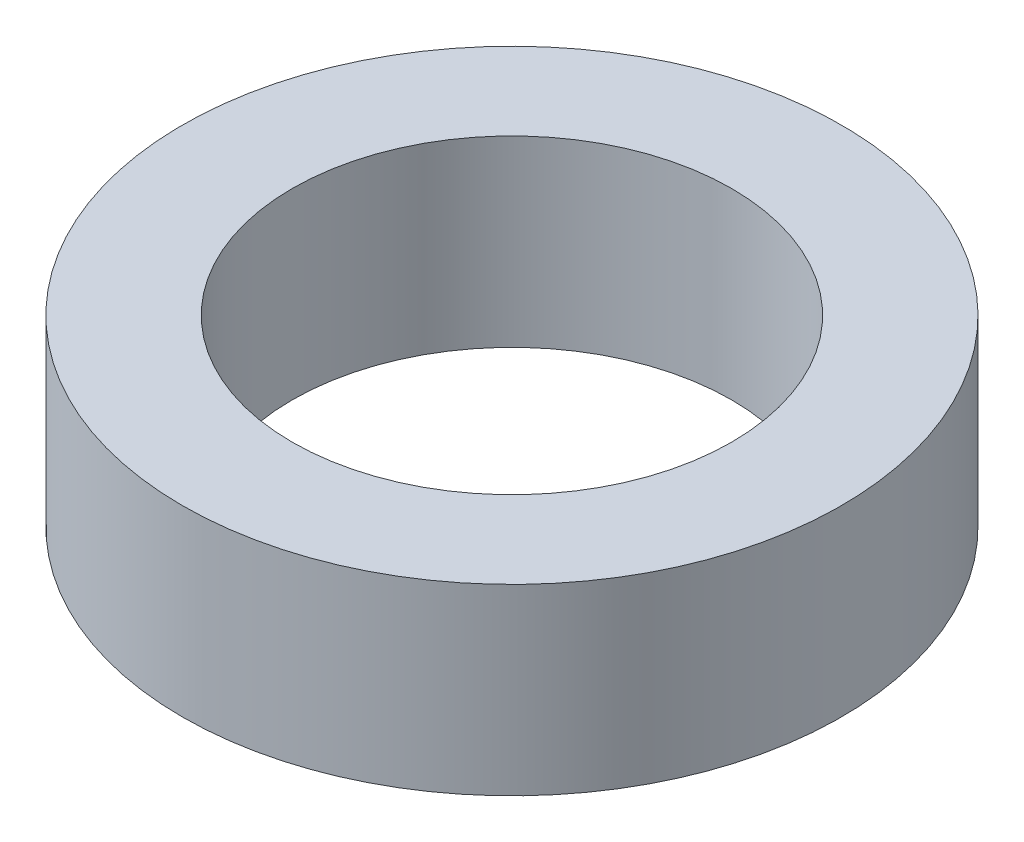
ISO-10303-21;
HEADER;
FILE_DESCRIPTION(('STEP AP214'),'2;1');
FILE_NAME('part.step','',(''),(''),'','','');
FILE_SCHEMA(('AUTOMOTIVE_DESIGN { 1 0 10303 214 1 1 1 1 }'));
ENDSEC;
DATA;
#1=APPLICATION_CONTEXT('core data for automotive mechanical design processes');
#2=APPLICATION_PROTOCOL_DEFINITION('international standard','automotive_design',2000,#1);
#3=PRODUCT_CONTEXT('',#1,'mechanical');
#4=PRODUCT('Part','Part','',(#3));
#5=PRODUCT_RELATED_PRODUCT_CATEGORY('part','',(#4));
#6=PRODUCT_DEFINITION_FORMATION('','',#4);
#7=PRODUCT_DEFINITION_CONTEXT('part definition',#1,'design');
#8=PRODUCT_DEFINITION('design','',#6,#7);
#9=PRODUCT_DEFINITION_SHAPE('','',#8);
#10=(LENGTH_UNIT() NAMED_UNIT(*) SI_UNIT(.MILLI.,.METRE.));
#11=(NAMED_UNIT(*) PLANE_ANGLE_UNIT() SI_UNIT($,.RADIAN.));
#12=(NAMED_UNIT(*) SI_UNIT($,.STERADIAN.) SOLID_ANGLE_UNIT());
#13=UNCERTAINTY_MEASURE_WITH_UNIT(LENGTH_MEASURE(1.E-05),#10,'distance_accuracy_value','');
#14=(GEOMETRIC_REPRESENTATION_CONTEXT(3) GLOBAL_UNCERTAINTY_ASSIGNED_CONTEXT((#13)) GLOBAL_UNIT_ASSIGNED_CONTEXT((#10,
#11,#12)) REPRESENTATION_CONTEXT('',''));
#15=CARTESIAN_POINT('',(0.,0.,0.));
#16=DIRECTION('',(0.,0.,1.));
#17=DIRECTION('',(1.,0.,0.));
#18=AXIS2_PLACEMENT_3D('',#15,#16,#17);
#19=CARTESIAN_POINT('',(0.,10.,0.));
#20=DIRECTION('',(0.,1.,0.));
#21=DIRECTION('',(0.,0.,1.));
#22=AXIS2_PLACEMENT_3D('',#19,#20,#21);
#23=PLANE('',#22);
#24=CARTESIAN_POINT('',(0.,10.,0.));
#25=DIRECTION('',(0.,1.,0.));
#26=DIRECTION('',(0.,0.,1.));
#27=AXIS2_PLACEMENT_3D('',#24,#25,#26);
#28=CIRCLE('',#27,18.);
#29=CARTESIAN_POINT('',(0.,10.,18.));
#30=VERTEX_POINT('',#29);
#31=EDGE_CURVE('E10',#30,#30,#28,.T.);
#32=ORIENTED_EDGE('',*,*,#31,.T.);
#33=EDGE_LOOP('',(#32));
#34=FACE_BOUND('',#33,.T.);
#35=CARTESIAN_POINT('',(0.,10.,0.));
#36=DIRECTION('',(0.,1.,0.));
#37=DIRECTION('',(0.,0.,1.));
#38=AXIS2_PLACEMENT_3D('',#35,#36,#37);
#39=CIRCLE('',#38,12.);
#40=CARTESIAN_POINT('',(0.,10.,12.));
#41=VERTEX_POINT('',#40);
#42=EDGE_CURVE('E50',#41,#41,#39,.T.);
#43=ORIENTED_EDGE('',*,*,#42,.F.);
#44=EDGE_LOOP('',(#43));
#45=FACE_BOUND('',#44,.T.);
#46=ADVANCED_FACE('F37',(#34,#45),#23,.T.);
#47=CARTESIAN_POINT('',(0.,0.,0.));
#48=DIRECTION('',(0.,1.,0.));
#49=DIRECTION('',(0.,0.,1.));
#50=AXIS2_PLACEMENT_3D('',#47,#48,#49);
#51=PLANE('',#50);
#52=CARTESIAN_POINT('',(0.,0.,0.));
#53=DIRECTION('',(0.,1.,0.));
#54=DIRECTION('',(0.,0.,1.));
#55=AXIS2_PLACEMENT_3D('',#52,#53,#54);
#56=CIRCLE('',#55,18.);
#57=CARTESIAN_POINT('',(0.,0.,18.));
#58=VERTEX_POINT('',#57);
#59=EDGE_CURVE('E41',#58,#58,#56,.T.);
#60=ORIENTED_EDGE('',*,*,#59,.F.);
#61=EDGE_LOOP('',(#60));
#62=FACE_BOUND('',#61,.T.);
#63=CARTESIAN_POINT('',(0.,0.,0.));
#64=DIRECTION('',(0.,1.,0.));
#65=DIRECTION('',(0.,0.,1.));
#66=AXIS2_PLACEMENT_3D('',#63,#64,#65);
#67=CIRCLE('',#66,12.);
#68=CARTESIAN_POINT('',(0.,0.,12.));
#69=VERTEX_POINT('',#68);
#70=EDGE_CURVE('E52',#69,#69,#67,.T.);
#71=ORIENTED_EDGE('',*,*,#70,.T.);
#72=EDGE_LOOP('',(#71));
#73=FACE_BOUND('',#72,.T.);
#74=ADVANCED_FACE('F64',(#62,#73),#51,.F.);
#75=CARTESIAN_POINT('',(0.,10.,0.));
#76=DIRECTION('',(0.,-1.,0.));
#77=DIRECTION('',(0.,0.,-1.));
#78=AXIS2_PLACEMENT_3D('',#75,#76,#77);
#79=CYLINDRICAL_SURFACE('',#78,18.);
#80=ORIENTED_EDGE('',*,*,#31,.F.);
#81=EDGE_LOOP('',(#80));
#82=FACE_BOUND('',#81,.T.);
#83=ORIENTED_EDGE('',*,*,#59,.T.);
#84=EDGE_LOOP('',(#83));
#85=FACE_BOUND('',#84,.T.);
#86=ADVANCED_FACE('F39',(#82,#85),#79,.T.);
#87=CARTESIAN_POINT('',(0.,10.,0.));
#88=DIRECTION('',(0.,-1.,0.));
#89=DIRECTION('',(0.,0.,-1.));
#90=AXIS2_PLACEMENT_3D('',#87,#88,#89);
#91=CYLINDRICAL_SURFACE('',#90,12.);
#92=ORIENTED_EDGE('',*,*,#42,.T.);
#93=EDGE_LOOP('',(#92));
#94=FACE_BOUND('',#93,.T.);
#95=ORIENTED_EDGE('',*,*,#70,.F.);
#96=EDGE_LOOP('',(#95));
#97=FACE_BOUND('',#96,.T.);
#98=ADVANCED_FACE('F60',(#94,#97),#91,.F.);
#99=CLOSED_SHELL('',(#46,#74,#86,#98));
#100=MANIFOLD_SOLID_BREP('B2',#99);
#101=ADVANCED_BREP_SHAPE_REPRESENTATION('',(#18,#100),#14);
#102=SHAPE_DEFINITION_REPRESENTATION(#9,#101);
ENDSEC;
END-ISO-10303-21;
